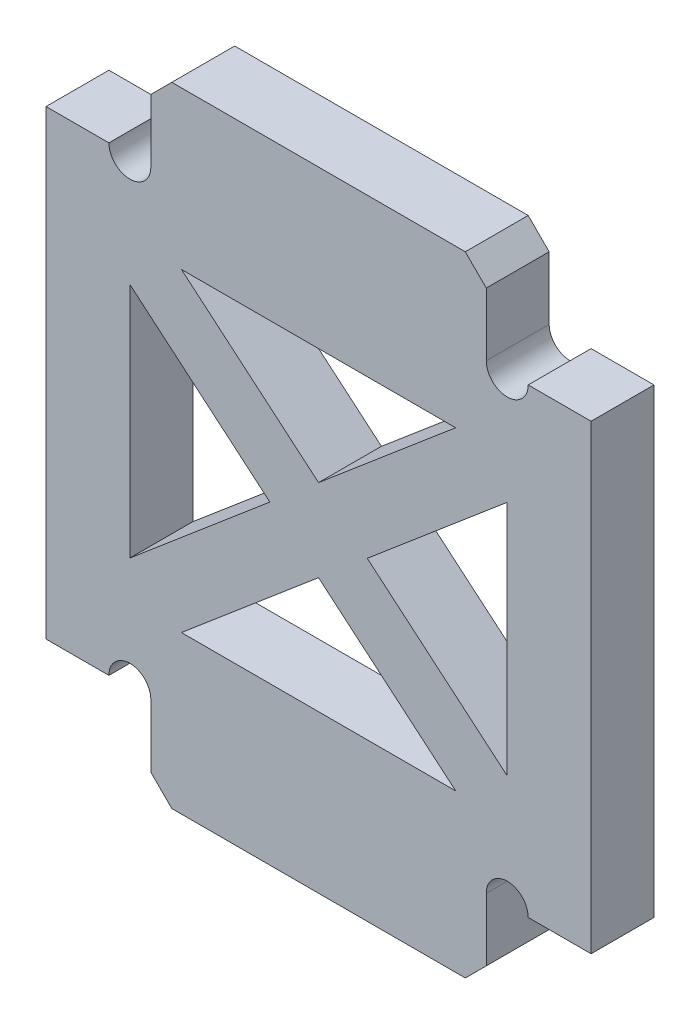
ISO-10303-21;
HEADER;
FILE_DESCRIPTION(('STEP AP214'),'2;1');
FILE_NAME('part.step','',(''),(''),'','','');
FILE_SCHEMA(('AUTOMOTIVE_DESIGN { 1 0 10303 214 1 1 1 1 }'));
ENDSEC;
DATA;
#1=APPLICATION_CONTEXT('core data for automotive mechanical design processes');
#2=APPLICATION_PROTOCOL_DEFINITION('international standard','automotive_design',2000,#1);
#3=PRODUCT_CONTEXT('',#1,'mechanical');
#4=PRODUCT('Part','Part','',(#3));
#5=PRODUCT_RELATED_PRODUCT_CATEGORY('part','',(#4));
#6=PRODUCT_DEFINITION_FORMATION('','',#4);
#7=PRODUCT_DEFINITION_CONTEXT('part definition',#1,'design');
#8=PRODUCT_DEFINITION('design','',#6,#7);
#9=PRODUCT_DEFINITION_SHAPE('','',#8);
#10=(LENGTH_UNIT() NAMED_UNIT(*) SI_UNIT(.MILLI.,.METRE.));
#11=(NAMED_UNIT(*) PLANE_ANGLE_UNIT() SI_UNIT($,.RADIAN.));
#12=(NAMED_UNIT(*) SI_UNIT($,.STERADIAN.) SOLID_ANGLE_UNIT());
#13=UNCERTAINTY_MEASURE_WITH_UNIT(LENGTH_MEASURE(1.E-05),#10,'distance_accuracy_value','');
#14=(GEOMETRIC_REPRESENTATION_CONTEXT(3) GLOBAL_UNCERTAINTY_ASSIGNED_CONTEXT((#13)) GLOBAL_UNIT_ASSIGNED_CONTEXT((#10,
#11,#12)) REPRESENTATION_CONTEXT('',''));
#15=CARTESIAN_POINT('',(0.,0.,0.));
#16=DIRECTION('',(0.,0.,1.));
#17=DIRECTION('',(1.,0.,0.));
#18=AXIS2_PLACEMENT_3D('',#15,#16,#17);
#19=CARTESIAN_POINT('',(0.,-11.,1.5));
#20=DIRECTION('',(0.,1.,0.));
#21=DIRECTION('',(0.,0.,1.));
#22=AXIS2_PLACEMENT_3D('',#19,#20,#21);
#23=PLANE('',#22);
#24=DIRECTION('',(1.,0.,0.));
#25=VECTOR('',#24,1.);
#26=CARTESIAN_POINT('',(0.,-11.,-1.5));
#27=LINE('',#26,#25);
#28=CARTESIAN_POINT('',(-13.,-11.,-1.5));
#29=VERTEX_POINT('',#28);
#30=CARTESIAN_POINT('',(-10.,-11.,-1.5));
#31=VERTEX_POINT('',#30);
#32=EDGE_CURVE('E373',#29,#31,#27,.T.);
#33=ORIENTED_EDGE('',*,*,#32,.T.);
#34=DIRECTION('',(0.,0.,-1.));
#35=VECTOR('',#34,1.);
#36=CARTESIAN_POINT('',(-10.,-11.,1.5));
#37=LINE('',#36,#35);
#38=CARTESIAN_POINT('',(-10.,-11.,1.5));
#39=VERTEX_POINT('',#38);
#40=EDGE_CURVE('E437',#39,#31,#37,.T.);
#41=ORIENTED_EDGE('',*,*,#40,.F.);
#42=DIRECTION('',(1.,0.,0.));
#43=VECTOR('',#42,1.);
#44=CARTESIAN_POINT('',(0.,-11.,1.5));
#45=LINE('',#44,#43);
#46=CARTESIAN_POINT('',(-13.,-11.,1.5));
#47=VERTEX_POINT('',#46);
#48=EDGE_CURVE('E301',#47,#39,#45,.T.);
#49=ORIENTED_EDGE('',*,*,#48,.F.);
#50=DIRECTION('',(0.,0.,-1.));
#51=VECTOR('',#50,1.);
#52=CARTESIAN_POINT('',(-13.,-11.,1.5));
#53=LINE('',#52,#51);
#54=EDGE_CURVE('E411',#47,#29,#53,.T.);
#55=ORIENTED_EDGE('',*,*,#54,.T.);
#56=EDGE_LOOP('',(#33,#41,#49,#55));
#57=FACE_BOUND('',#56,.T.);
#58=ADVANCED_FACE('F37',(#57),#23,.F.);
#59=CARTESIAN_POINT('',(-9.,-11.,1.5));
#60=DIRECTION('',(0.,0.,-1.));
#61=DIRECTION('',(-1.,0.,0.));
#62=AXIS2_PLACEMENT_3D('',#59,#60,#61);
#63=CYLINDRICAL_SURFACE('',#62,1.);
#64=CARTESIAN_POINT('',(-9.,-11.,-1.5));
#65=DIRECTION('',(0.,0.,1.));
#66=DIRECTION('',(1.,0.,0.));
#67=AXIS2_PLACEMENT_3D('',#64,#65,#66);
#68=CIRCLE('',#67,1.);
#69=CARTESIAN_POINT('',(-8.,-11.,-1.5));
#70=VERTEX_POINT('',#69);
#71=EDGE_CURVE('E376',#31,#70,#68,.F.);
#72=ORIENTED_EDGE('',*,*,#71,.T.);
#73=DIRECTION('',(0.,0.,-1.));
#74=VECTOR('',#73,1.);
#75=CARTESIAN_POINT('',(-8.,-11.,1.5));
#76=LINE('',#75,#74);
#77=CARTESIAN_POINT('',(-8.,-11.,1.5));
#78=VERTEX_POINT('',#77);
#79=EDGE_CURVE('E434',#78,#70,#76,.T.);
#80=ORIENTED_EDGE('',*,*,#79,.F.);
#81=CARTESIAN_POINT('',(-9.,-11.,1.5));
#82=DIRECTION('',(0.,0.,1.));
#83=DIRECTION('',(1.,0.,0.));
#84=AXIS2_PLACEMENT_3D('',#81,#82,#83);
#85=CIRCLE('',#84,1.);
#86=EDGE_CURVE('E304',#39,#78,#85,.F.);
#87=ORIENTED_EDGE('',*,*,#86,.F.);
#88=ORIENTED_EDGE('',*,*,#40,.T.);
#89=EDGE_LOOP('',(#72,#80,#87,#88));
#90=FACE_BOUND('',#89,.T.);
#91=ADVANCED_FACE('F529',(#90),#63,.F.);
#92=CARTESIAN_POINT('',(-8.,0.,1.5));
#93=DIRECTION('',(1.,0.,0.));
#94=DIRECTION('',(0.,0.,-1.));
#95=AXIS2_PLACEMENT_3D('',#92,#93,#94);
#96=PLANE('',#95);
#97=DIRECTION('',(0.,-1.,0.));
#98=VECTOR('',#97,1.);
#99=CARTESIAN_POINT('',(-8.,0.,-1.5));
#100=LINE('',#99,#98);
#101=CARTESIAN_POINT('',(-8.,-14.,-1.5));
#102=VERTEX_POINT('',#101);
#103=EDGE_CURVE('E379',#70,#102,#100,.T.);
#104=ORIENTED_EDGE('',*,*,#103,.T.);
#105=DIRECTION('',(0.,0.,1.));
#106=VECTOR('',#105,1.);
#107=CARTESIAN_POINT('',(-8.,-14.,1.5));
#108=LINE('',#107,#106);
#109=CARTESIAN_POINT('',(-8.,-14.,1.5));
#110=VERTEX_POINT('',#109);
#111=EDGE_CURVE('E481',#102,#110,#108,.T.);
#112=ORIENTED_EDGE('',*,*,#111,.T.);
#113=DIRECTION('',(0.,-1.,0.));
#114=VECTOR('',#113,1.);
#115=CARTESIAN_POINT('',(-8.,0.,1.5));
#116=LINE('',#115,#114);
#117=EDGE_CURVE('E307',#78,#110,#116,.T.);
#118=ORIENTED_EDGE('',*,*,#117,.F.);
#119=ORIENTED_EDGE('',*,*,#79,.T.);
#120=EDGE_LOOP('',(#104,#112,#118,#119));
#121=FACE_BOUND('',#120,.T.);
#122=ADVANCED_FACE('F585',(#121),#96,.F.);
#123=CARTESIAN_POINT('',(0.,-15.,1.5));
#124=DIRECTION('',(0.,1.,0.));
#125=DIRECTION('',(0.,0.,1.));
#126=AXIS2_PLACEMENT_3D('',#123,#124,#125);
#127=PLANE('',#126);
#128=DIRECTION('',(1.,0.,0.));
#129=VECTOR('',#128,1.);
#130=CARTESIAN_POINT('',(0.,-15.,-1.5));
#131=LINE('',#130,#129);
#132=CARTESIAN_POINT('',(-7.,-15.,-1.5));
#133=VERTEX_POINT('',#132);
#134=CARTESIAN_POINT('',(6.99999999999999,-15.,-1.5));
#135=VERTEX_POINT('',#134);
#136=EDGE_CURVE('E382',#133,#135,#131,.T.);
#137=ORIENTED_EDGE('',*,*,#136,.T.);
#138=DIRECTION('',(0.,0.,1.));
#139=VECTOR('',#138,1.);
#140=CARTESIAN_POINT('',(6.99999999999999,-15.,1.5));
#141=LINE('',#140,#139);
#142=CARTESIAN_POINT('',(6.99999999999999,-15.,1.5));
#143=VERTEX_POINT('',#142);
#144=EDGE_CURVE('E473',#135,#143,#141,.T.);
#145=ORIENTED_EDGE('',*,*,#144,.T.);
#146=DIRECTION('',(1.,0.,0.));
#147=VECTOR('',#146,1.);
#148=CARTESIAN_POINT('',(0.,-15.,1.5));
#149=LINE('',#148,#147);
#150=CARTESIAN_POINT('',(-7.,-15.,1.5));
#151=VERTEX_POINT('',#150);
#152=EDGE_CURVE('E310',#151,#143,#149,.T.);
#153=ORIENTED_EDGE('',*,*,#152,.F.);
#154=DIRECTION('',(0.,0.,-1.));
#155=VECTOR('',#154,1.);
#156=CARTESIAN_POINT('',(-7.,-15.,1.5));
#157=LINE('',#156,#155);
#158=EDGE_CURVE('E470',#151,#133,#157,.T.);
#159=ORIENTED_EDGE('',*,*,#158,.T.);
#160=EDGE_LOOP('',(#137,#145,#153,#159));
#161=FACE_BOUND('',#160,.T.);
#162=ADVANCED_FACE('F541',(#161),#127,.F.);
#163=CARTESIAN_POINT('',(8.,0.,1.5));
#164=DIRECTION('',(1.,0.,0.));
#165=DIRECTION('',(0.,0.,-1.));
#166=AXIS2_PLACEMENT_3D('',#163,#164,#165);
#167=PLANE('',#166);
#168=DIRECTION('',(0.,-1.,0.));
#169=VECTOR('',#168,1.);
#170=CARTESIAN_POINT('',(8.,0.,1.5));
#171=LINE('',#170,#169);
#172=CARTESIAN_POINT('',(8.,-11.,1.5));
#173=VERTEX_POINT('',#172);
#174=CARTESIAN_POINT('',(8.,-14.,1.5));
#175=VERTEX_POINT('',#174);
#176=EDGE_CURVE('E313',#173,#175,#171,.T.);
#177=ORIENTED_EDGE('',*,*,#176,.T.);
#178=DIRECTION('',(0.,0.,-1.));
#179=VECTOR('',#178,1.);
#180=CARTESIAN_POINT('',(8.,-14.,-1.5));
#181=LINE('',#180,#179);
#182=CARTESIAN_POINT('',(8.,-14.,-1.5));
#183=VERTEX_POINT('',#182);
#184=EDGE_CURVE('E440',#175,#183,#181,.T.);
#185=ORIENTED_EDGE('',*,*,#184,.T.);
#186=DIRECTION('',(0.,-1.,0.));
#187=VECTOR('',#186,1.);
#188=CARTESIAN_POINT('',(8.,0.,-1.5));
#189=LINE('',#188,#187);
#190=CARTESIAN_POINT('',(8.,-11.,-1.5));
#191=VERTEX_POINT('',#190);
#192=EDGE_CURVE('E385',#191,#183,#189,.T.);
#193=ORIENTED_EDGE('',*,*,#192,.F.);
#194=DIRECTION('',(0.,0.,-1.));
#195=VECTOR('',#194,1.);
#196=CARTESIAN_POINT('',(8.,-11.,1.5));
#197=LINE('',#196,#195);
#198=EDGE_CURVE('E432',#173,#191,#197,.T.);
#199=ORIENTED_EDGE('',*,*,#198,.F.);
#200=EDGE_LOOP('',(#177,#185,#193,#199));
#201=FACE_BOUND('',#200,.T.);
#202=ADVANCED_FACE('F550',(#201),#167,.T.);
#203=CARTESIAN_POINT('',(9.,-11.,1.5));
#204=DIRECTION('',(0.,0.,-1.));
#205=DIRECTION('',(-1.,0.,0.));
#206=AXIS2_PLACEMENT_3D('',#203,#204,#205);
#207=CYLINDRICAL_SURFACE('',#206,1.);
#208=CARTESIAN_POINT('',(9.,-11.,-1.5));
#209=DIRECTION('',(0.,0.,1.));
#210=DIRECTION('',(1.,0.,0.));
#211=AXIS2_PLACEMENT_3D('',#208,#209,#210);
#212=CIRCLE('',#211,1.);
#213=CARTESIAN_POINT('',(10.,-11.,-1.5));
#214=VERTEX_POINT('',#213);
#215=EDGE_CURVE('E388',#214,#191,#212,.T.);
#216=ORIENTED_EDGE('',*,*,#215,.F.);
#217=DIRECTION('',(0.,0.,-1.));
#218=VECTOR('',#217,1.);
#219=CARTESIAN_POINT('',(10.,-11.,1.5));
#220=LINE('',#219,#218);
#221=CARTESIAN_POINT('',(10.,-11.,1.5));
#222=VERTEX_POINT('',#221);
#223=EDGE_CURVE('E430',#222,#214,#220,.T.);
#224=ORIENTED_EDGE('',*,*,#223,.F.);
#225=CARTESIAN_POINT('',(9.,-11.,1.5));
#226=DIRECTION('',(0.,0.,1.));
#227=DIRECTION('',(1.,0.,0.));
#228=AXIS2_PLACEMENT_3D('',#225,#226,#227);
#229=CIRCLE('',#228,1.);
#230=EDGE_CURVE('E316',#222,#173,#229,.T.);
#231=ORIENTED_EDGE('',*,*,#230,.T.);
#232=ORIENTED_EDGE('',*,*,#198,.T.);
#233=EDGE_LOOP('',(#216,#224,#231,#232));
#234=FACE_BOUND('',#233,.T.);
#235=ADVANCED_FACE('F555',(#234),#207,.F.);
#236=CARTESIAN_POINT('',(13.,-11.,-1.5));
#237=VERTEX_POINT('',#236);
#238=EDGE_CURVE('E377',#214,#237,#27,.T.);
#239=ORIENTED_EDGE('',*,*,#238,.T.);
#240=DIRECTION('',(0.,0.,-1.));
#241=VECTOR('',#240,1.);
#242=CARTESIAN_POINT('',(13.,-11.,1.5));
#243=LINE('',#242,#241);
#244=CARTESIAN_POINT('',(13.,-11.,1.5));
#245=VERTEX_POINT('',#244);
#246=EDGE_CURVE('E428',#245,#237,#243,.T.);
#247=ORIENTED_EDGE('',*,*,#246,.F.);
#248=EDGE_CURVE('E305',#222,#245,#45,.T.);
#249=ORIENTED_EDGE('',*,*,#248,.F.);
#250=ORIENTED_EDGE('',*,*,#223,.T.);
#251=EDGE_LOOP('',(#239,#247,#249,#250));
#252=FACE_BOUND('',#251,.T.);
#253=ADVANCED_FACE('F561',(#252),#23,.F.);
#254=CARTESIAN_POINT('',(13.,0.,1.5));
#255=DIRECTION('',(1.,0.,0.));
#256=DIRECTION('',(0.,0.,-1.));
#257=AXIS2_PLACEMENT_3D('',#254,#255,#256);
#258=PLANE('',#257);
#259=DIRECTION('',(0.,-1.,0.));
#260=VECTOR('',#259,1.);
#261=CARTESIAN_POINT('',(13.,0.,-1.5));
#262=LINE('',#261,#260);
#263=CARTESIAN_POINT('',(13.,11.,-1.5));
#264=VERTEX_POINT('',#263);
#265=EDGE_CURVE('E391',#264,#237,#262,.T.);
#266=ORIENTED_EDGE('',*,*,#265,.F.);
#267=DIRECTION('',(0.,0.,-1.));
#268=VECTOR('',#267,1.);
#269=CARTESIAN_POINT('',(13.,11.,1.5));
#270=LINE('',#269,#268);
#271=CARTESIAN_POINT('',(13.,11.,1.5));
#272=VERTEX_POINT('',#271);
#273=EDGE_CURVE('E426',#272,#264,#270,.T.);
#274=ORIENTED_EDGE('',*,*,#273,.F.);
#275=DIRECTION('',(0.,-1.,0.));
#276=VECTOR('',#275,1.);
#277=CARTESIAN_POINT('',(13.,0.,1.5));
#278=LINE('',#277,#276);
#279=EDGE_CURVE('E319',#272,#245,#278,.T.);
#280=ORIENTED_EDGE('',*,*,#279,.T.);
#281=ORIENTED_EDGE('',*,*,#246,.T.);
#282=EDGE_LOOP('',(#266,#274,#280,#281));
#283=FACE_BOUND('',#282,.T.);
#284=ADVANCED_FACE('F571',(#283),#258,.T.);
#285=CARTESIAN_POINT('',(0.,11.,1.5));
#286=DIRECTION('',(0.,1.,0.));
#287=DIRECTION('',(0.,0.,1.));
#288=AXIS2_PLACEMENT_3D('',#285,#286,#287);
#289=PLANE('',#288);
#290=DIRECTION('',(1.,0.,0.));
#291=VECTOR('',#290,1.);
#292=CARTESIAN_POINT('',(0.,11.,-1.5));
#293=LINE('',#292,#291);
#294=CARTESIAN_POINT('',(10.,11.,-1.5));
#295=VERTEX_POINT('',#294);
#296=EDGE_CURVE('E394',#295,#264,#293,.T.);
#297=ORIENTED_EDGE('',*,*,#296,.F.);
#298=DIRECTION('',(0.,0.,-1.));
#299=VECTOR('',#298,1.);
#300=CARTESIAN_POINT('',(10.,11.,1.5));
#301=LINE('',#300,#299);
#302=CARTESIAN_POINT('',(10.,11.,1.5));
#303=VERTEX_POINT('',#302);
#304=EDGE_CURVE('E424',#303,#295,#301,.T.);
#305=ORIENTED_EDGE('',*,*,#304,.F.);
#306=DIRECTION('',(1.,0.,0.));
#307=VECTOR('',#306,1.);
#308=CARTESIAN_POINT('',(0.,11.,1.5));
#309=LINE('',#308,#307);
#310=EDGE_CURVE('E322',#303,#272,#309,.T.);
#311=ORIENTED_EDGE('',*,*,#310,.T.);
#312=ORIENTED_EDGE('',*,*,#273,.T.);
#313=EDGE_LOOP('',(#297,#305,#311,#312));
#314=FACE_BOUND('',#313,.T.);
#315=ADVANCED_FACE('F566',(#314),#289,.T.);
#316=CARTESIAN_POINT('',(9.,11.,1.5));
#317=DIRECTION('',(0.,0.,-1.));
#318=DIRECTION('',(-1.,0.,0.));
#319=AXIS2_PLACEMENT_3D('',#316,#317,#318);
#320=CYLINDRICAL_SURFACE('',#319,1.);
#321=CARTESIAN_POINT('',(9.,11.,-1.5));
#322=DIRECTION('',(0.,0.,1.));
#323=DIRECTION('',(1.,0.,0.));
#324=AXIS2_PLACEMENT_3D('',#321,#322,#323);
#325=CIRCLE('',#324,1.);
#326=CARTESIAN_POINT('',(8.,11.,-1.5));
#327=VERTEX_POINT('',#326);
#328=EDGE_CURVE('E397',#295,#327,#325,.F.);
#329=ORIENTED_EDGE('',*,*,#328,.T.);
#330=DIRECTION('',(0.,0.,-1.));
#331=VECTOR('',#330,1.);
#332=CARTESIAN_POINT('',(8.,11.,1.5));
#333=LINE('',#332,#331);
#334=CARTESIAN_POINT('',(8.,11.,1.5));
#335=VERTEX_POINT('',#334);
#336=EDGE_CURVE('E421',#335,#327,#333,.T.);
#337=ORIENTED_EDGE('',*,*,#336,.F.);
#338=CARTESIAN_POINT('',(9.,11.,1.5));
#339=DIRECTION('',(0.,0.,1.));
#340=DIRECTION('',(1.,0.,0.));
#341=AXIS2_PLACEMENT_3D('',#338,#339,#340);
#342=CIRCLE('',#341,1.);
#343=EDGE_CURVE('E325',#303,#335,#342,.F.);
#344=ORIENTED_EDGE('',*,*,#343,.F.);
#345=ORIENTED_EDGE('',*,*,#304,.T.);
#346=EDGE_LOOP('',(#329,#337,#344,#345));
#347=FACE_BOUND('',#346,.T.);
#348=ADVANCED_FACE('F570',(#347),#320,.F.);
#349=CARTESIAN_POINT('',(8.,0.,1.5));
#350=DIRECTION('',(-1.,0.,0.));
#351=DIRECTION('',(0.,0.,1.));
#352=AXIS2_PLACEMENT_3D('',#349,#350,#351);
#353=PLANE('',#352);
#354=DIRECTION('',(0.,1.,0.));
#355=VECTOR('',#354,1.);
#356=CARTESIAN_POINT('',(8.,0.,-1.5));
#357=LINE('',#356,#355);
#358=CARTESIAN_POINT('',(8.,14.,-1.5));
#359=VERTEX_POINT('',#358);
#360=EDGE_CURVE('E399',#327,#359,#357,.T.);
#361=ORIENTED_EDGE('',*,*,#360,.T.);
#362=DIRECTION('',(0.,0.,1.));
#363=VECTOR('',#362,1.);
#364=CARTESIAN_POINT('',(8.,14.,1.5));
#365=LINE('',#364,#363);
#366=CARTESIAN_POINT('',(8.,14.,1.5));
#367=VERTEX_POINT('',#366);
#368=EDGE_CURVE('E45',#359,#367,#365,.T.);
#369=ORIENTED_EDGE('',*,*,#368,.T.);
#370=DIRECTION('',(0.,1.,0.));
#371=VECTOR('',#370,1.);
#372=CARTESIAN_POINT('',(8.,0.,1.5));
#373=LINE('',#372,#371);
#374=EDGE_CURVE('E328',#335,#367,#373,.T.);
#375=ORIENTED_EDGE('',*,*,#374,.F.);
#376=ORIENTED_EDGE('',*,*,#336,.T.);
#377=EDGE_LOOP('',(#361,#369,#375,#376));
#378=FACE_BOUND('',#377,.T.);
#379=ADVANCED_FACE('F490',(#378),#353,.F.);
#380=CARTESIAN_POINT('',(0.,15.,1.5));
#381=DIRECTION('',(0.,1.,0.));
#382=DIRECTION('',(0.,0.,1.));
#383=AXIS2_PLACEMENT_3D('',#380,#381,#382);
#384=PLANE('',#383);
#385=DIRECTION('',(1.,0.,0.));
#386=VECTOR('',#385,1.);
#387=CARTESIAN_POINT('',(0.,15.,1.5));
#388=LINE('',#387,#386);
#389=CARTESIAN_POINT('',(-6.99999999999999,15.,1.5));
#390=VERTEX_POINT('',#389);
#391=CARTESIAN_POINT('',(7.,15.,1.5));
#392=VERTEX_POINT('',#391);
#393=EDGE_CURVE('E330',#390,#392,#388,.T.);
#394=ORIENTED_EDGE('',*,*,#393,.T.);
#395=DIRECTION('',(0.,0.,-1.));
#396=VECTOR('',#395,1.);
#397=CARTESIAN_POINT('',(7.,15.,-1.5));
#398=LINE('',#397,#396);
#399=CARTESIAN_POINT('',(7.,15.,-1.5));
#400=VERTEX_POINT('',#399);
#401=EDGE_CURVE('E485',#392,#400,#398,.T.);
#402=ORIENTED_EDGE('',*,*,#401,.T.);
#403=DIRECTION('',(1.,0.,0.));
#404=VECTOR('',#403,1.);
#405=CARTESIAN_POINT('',(0.,15.,-1.5));
#406=LINE('',#405,#404);
#407=CARTESIAN_POINT('',(-6.99999999999999,15.,-1.5));
#408=VERTEX_POINT('',#407);
#409=EDGE_CURVE('E402',#408,#400,#406,.T.);
#410=ORIENTED_EDGE('',*,*,#409,.F.);
#411=DIRECTION('',(0.,0.,1.));
#412=VECTOR('',#411,1.);
#413=CARTESIAN_POINT('',(-6.99999999999999,15.,1.5));
#414=LINE('',#413,#412);
#415=EDGE_CURVE('E483',#408,#390,#414,.T.);
#416=ORIENTED_EDGE('',*,*,#415,.T.);
#417=EDGE_LOOP('',(#394,#402,#410,#416));
#418=FACE_BOUND('',#417,.T.);
#419=ADVANCED_FACE('F500',(#418),#384,.T.);
#420=CARTESIAN_POINT('',(-8.,0.,1.5));
#421=DIRECTION('',(-1.,0.,0.));
#422=DIRECTION('',(0.,0.,1.));
#423=AXIS2_PLACEMENT_3D('',#420,#421,#422);
#424=PLANE('',#423);
#425=DIRECTION('',(0.,1.,0.));
#426=VECTOR('',#425,1.);
#427=CARTESIAN_POINT('',(-8.,0.,1.5));
#428=LINE('',#427,#426);
#429=CARTESIAN_POINT('',(-8.,11.,1.5));
#430=VERTEX_POINT('',#429);
#431=CARTESIAN_POINT('',(-8.,14.,1.5));
#432=VERTEX_POINT('',#431);
#433=EDGE_CURVE('E332',#430,#432,#428,.T.);
#434=ORIENTED_EDGE('',*,*,#433,.T.);
#435=DIRECTION('',(0.,0.,-1.));
#436=VECTOR('',#435,1.);
#437=CARTESIAN_POINT('',(-8.,14.,1.5));
#438=LINE('',#437,#436);
#439=CARTESIAN_POINT('',(-8.,14.,-1.5));
#440=VERTEX_POINT('',#439);
#441=EDGE_CURVE('E11',#432,#440,#438,.T.);
#442=ORIENTED_EDGE('',*,*,#441,.T.);
#443=DIRECTION('',(0.,1.,0.));
#444=VECTOR('',#443,1.);
#445=CARTESIAN_POINT('',(-8.,0.,-1.5));
#446=LINE('',#445,#444);
#447=CARTESIAN_POINT('',(-8.,11.,-1.5));
#448=VERTEX_POINT('',#447);
#449=EDGE_CURVE('E405',#448,#440,#446,.T.);
#450=ORIENTED_EDGE('',*,*,#449,.F.);
#451=DIRECTION('',(0.,0.,-1.));
#452=VECTOR('',#451,1.);
#453=CARTESIAN_POINT('',(-8.,11.,1.5));
#454=LINE('',#453,#452);
#455=EDGE_CURVE('E419',#430,#448,#454,.T.);
#456=ORIENTED_EDGE('',*,*,#455,.F.);
#457=EDGE_LOOP('',(#434,#442,#450,#456));
#458=FACE_BOUND('',#457,.T.);
#459=ADVANCED_FACE('F508',(#458),#424,.T.);
#460=CARTESIAN_POINT('',(-9.,11.,1.5));
#461=DIRECTION('',(0.,0.,-1.));
#462=DIRECTION('',(-1.,0.,0.));
#463=AXIS2_PLACEMENT_3D('',#460,#461,#462);
#464=CYLINDRICAL_SURFACE('',#463,1.);
#465=CARTESIAN_POINT('',(-9.,11.,-1.5));
#466=DIRECTION('',(0.,0.,1.));
#467=DIRECTION('',(1.,0.,0.));
#468=AXIS2_PLACEMENT_3D('',#465,#466,#467);
#469=CIRCLE('',#468,1.);
#470=CARTESIAN_POINT('',(-10.,11.,-1.5));
#471=VERTEX_POINT('',#470);
#472=EDGE_CURVE('E408',#471,#448,#469,.T.);
#473=ORIENTED_EDGE('',*,*,#472,.F.);
#474=DIRECTION('',(0.,0.,-1.));
#475=VECTOR('',#474,1.);
#476=CARTESIAN_POINT('',(-10.,11.,1.5));
#477=LINE('',#476,#475);
#478=CARTESIAN_POINT('',(-10.,11.,1.5));
#479=VERTEX_POINT('',#478);
#480=EDGE_CURVE('E417',#479,#471,#477,.T.);
#481=ORIENTED_EDGE('',*,*,#480,.F.);
#482=CARTESIAN_POINT('',(-9.,11.,1.5));
#483=DIRECTION('',(0.,0.,1.));
#484=DIRECTION('',(1.,0.,0.));
#485=AXIS2_PLACEMENT_3D('',#482,#483,#484);
#486=CIRCLE('',#485,1.);
#487=EDGE_CURVE('E334',#479,#430,#486,.T.);
#488=ORIENTED_EDGE('',*,*,#487,.T.);
#489=ORIENTED_EDGE('',*,*,#455,.T.);
#490=EDGE_LOOP('',(#473,#481,#488,#489));
#491=FACE_BOUND('',#490,.T.);
#492=ADVANCED_FACE('F514',(#491),#464,.F.);
#493=CARTESIAN_POINT('',(-13.,11.,-1.5));
#494=VERTEX_POINT('',#493);
#495=EDGE_CURVE('E273',#494,#471,#293,.T.);
#496=ORIENTED_EDGE('',*,*,#495,.F.);
#497=DIRECTION('',(0.,0.,-1.));
#498=VECTOR('',#497,1.);
#499=CARTESIAN_POINT('',(-13.,11.,1.5));
#500=LINE('',#499,#498);
#501=CARTESIAN_POINT('',(-13.,11.,1.5));
#502=VERTEX_POINT('',#501);
#503=EDGE_CURVE('E414',#502,#494,#500,.T.);
#504=ORIENTED_EDGE('',*,*,#503,.F.);
#505=EDGE_CURVE('E326',#502,#479,#309,.T.);
#506=ORIENTED_EDGE('',*,*,#505,.T.);
#507=ORIENTED_EDGE('',*,*,#480,.T.);
#508=EDGE_LOOP('',(#496,#504,#506,#507));
#509=FACE_BOUND('',#508,.T.);
#510=ADVANCED_FACE('F518',(#509),#289,.T.);
#511=CARTESIAN_POINT('',(-0.968913362199259,-1.14507942805367,1.5));
#512=DIRECTION('',(-0.645942241466174,-0.763386285369115,0.));
#513=DIRECTION('',(0.763386285369115,-0.645942241466174,0.));
#514=AXIS2_PLACEMENT_3D('',#511,#512,#513);
#515=PLANE('',#514);
#516=DIRECTION('',(-0.763386285369115,0.645942241466174,0.));
#517=VECTOR('',#516,1.);
#518=CARTESIAN_POINT('',(-0.968913362199259,-1.14507942805367,-1.5));
#519=LINE('',#518,#517);
#520=CARTESIAN_POINT('',(-2.32218904989905,0.,-1.5));
#521=VERTEX_POINT('',#520);
#522=CARTESIAN_POINT('',(-9.,5.65045541931618,-1.5));
#523=VERTEX_POINT('',#522);
#524=EDGE_CURVE('E364',#521,#523,#519,.T.);
#525=ORIENTED_EDGE('',*,*,#524,.F.);
#526=DIRECTION('',(0.,0.,-1.));
#527=VECTOR('',#526,1.);
#528=CARTESIAN_POINT('',(-2.32218904989905,0.,1.5));
#529=LINE('',#528,#527);
#530=CARTESIAN_POINT('',(-2.32218904989905,0.,1.5));
#531=VERTEX_POINT('',#530);
#532=EDGE_CURVE('E415',#531,#521,#529,.T.);
#533=ORIENTED_EDGE('',*,*,#532,.F.);
#534=DIRECTION('',(-0.763386285369115,0.645942241466174,0.));
#535=VECTOR('',#534,1.);
#536=CARTESIAN_POINT('',(-0.968913362199259,-1.14507942805367,1.5));
#537=LINE('',#536,#535);
#538=CARTESIAN_POINT('',(-9.,5.65045541931618,1.5));
#539=VERTEX_POINT('',#538);
#540=EDGE_CURVE('E293',#531,#539,#537,.T.);
#541=ORIENTED_EDGE('',*,*,#540,.T.);
#542=DIRECTION('',(0.,0.,-1.));
#543=VECTOR('',#542,1.);
#544=CARTESIAN_POINT('',(-9.,5.65045541931618,1.5));
#545=LINE('',#544,#543);
#546=EDGE_CURVE('E441',#539,#523,#545,.T.);
#547=ORIENTED_EDGE('',*,*,#546,.T.);
#548=EDGE_LOOP('',(#525,#533,#541,#547));
#549=FACE_BOUND('',#548,.T.);
#550=ADVANCED_FACE('F605',(#549),#515,.T.);
#551=CARTESIAN_POINT('',(-0.968913362199259,1.14507942805367,1.5));
#552=DIRECTION('',(0.645942241466174,-0.763386285369115,0.));
#553=DIRECTION('',(0.763386285369115,0.645942241466174,0.));
#554=AXIS2_PLACEMENT_3D('',#551,#552,#553);
#555=PLANE('',#554);
#556=DIRECTION('',(-0.763386285369115,-0.645942241466174,0.));
#557=VECTOR('',#556,1.);
#558=CARTESIAN_POINT('',(-0.968913362199259,1.14507942805367,-1.5));
#559=LINE('',#558,#557);
#560=CARTESIAN_POINT('',(-9.,-5.65045541931618,-1.5));
#561=VERTEX_POINT('',#560);
#562=EDGE_CURVE('E367',#521,#561,#559,.T.);
#563=ORIENTED_EDGE('',*,*,#562,.T.);
#564=DIRECTION('',(0.,0.,-1.));
#565=VECTOR('',#564,1.);
#566=CARTESIAN_POINT('',(-9.,-5.65045541931618,1.5));
#567=LINE('',#566,#565);
#568=CARTESIAN_POINT('',(-9.,-5.65045541931618,1.5));
#569=VERTEX_POINT('',#568);
#570=EDGE_CURVE('E443',#569,#561,#567,.T.);
#571=ORIENTED_EDGE('',*,*,#570,.F.);
#572=DIRECTION('',(-0.763386285369115,-0.645942241466174,0.));
#573=VECTOR('',#572,1.);
#574=CARTESIAN_POINT('',(-0.968913362199259,1.14507942805367,1.5));
#575=LINE('',#574,#573);
#576=EDGE_CURVE('E296',#531,#569,#575,.T.);
#577=ORIENTED_EDGE('',*,*,#576,.F.);
#578=ORIENTED_EDGE('',*,*,#532,.T.);
#579=EDGE_LOOP('',(#563,#571,#577,#578));
#580=FACE_BOUND('',#579,.T.);
#581=ADVANCED_FACE('F601',(#580),#555,.F.);
#582=CARTESIAN_POINT('',(0.,7.5,1.5));
#583=DIRECTION('',(0.,-1.,0.));
#584=DIRECTION('',(0.,0.,-1.));
#585=AXIS2_PLACEMENT_3D('',#582,#583,#584);
#586=PLANE('',#585);
#587=DIRECTION('',(-1.,0.,0.));
#588=VECTOR('',#587,1.);
#589=CARTESIAN_POINT('',(0.,7.5,-1.5));
#590=LINE('',#589,#588);
#591=CARTESIAN_POINT('',(6.54144731373731,7.5,-1.5));
#592=VERTEX_POINT('',#591);
#593=CARTESIAN_POINT('',(-6.54144731373731,7.5,-1.5));
#594=VERTEX_POINT('',#593);
#595=EDGE_CURVE('E355',#592,#594,#590,.T.);
#596=ORIENTED_EDGE('',*,*,#595,.F.);
#597=DIRECTION('',(0.,0.,-1.));
#598=VECTOR('',#597,1.);
#599=CARTESIAN_POINT('',(6.54144731373731,7.5,1.5));
#600=LINE('',#599,#598);
#601=CARTESIAN_POINT('',(6.54144731373731,7.5,1.5));
#602=VERTEX_POINT('',#601);
#603=EDGE_CURVE('E444',#602,#592,#600,.T.);
#604=ORIENTED_EDGE('',*,*,#603,.F.);
#605=DIRECTION('',(-1.,0.,0.));
#606=VECTOR('',#605,1.);
#607=CARTESIAN_POINT('',(0.,7.5,1.5));
#608=LINE('',#607,#606);
#609=CARTESIAN_POINT('',(-6.54144731373731,7.5,1.5));
#610=VERTEX_POINT('',#609);
#611=EDGE_CURVE('E285',#602,#610,#608,.T.);
#612=ORIENTED_EDGE('',*,*,#611,.T.);
#613=DIRECTION('',(0.,0.,-1.));
#614=VECTOR('',#613,1.);
#615=CARTESIAN_POINT('',(-6.54144731373731,7.5,1.5));
#616=LINE('',#615,#614);
#617=EDGE_CURVE('E447',#610,#594,#616,.T.);
#618=ORIENTED_EDGE('',*,*,#617,.T.);
#619=EDGE_LOOP('',(#596,#604,#612,#618));
#620=FACE_BOUND('',#619,.T.);
#621=ADVANCED_FACE('F604',(#620),#586,.T.);
#622=CARTESIAN_POINT('',(-0.968913362199264,1.14507942805368,1.5));
#623=DIRECTION('',(0.645942241466174,-0.763386285369115,0.));
#624=DIRECTION('',(0.763386285369115,0.645942241466174,0.));
#625=AXIS2_PLACEMENT_3D('',#622,#623,#624);
#626=PLANE('',#625);
#627=DIRECTION('',(-0.763386285369115,-0.645942241466174,0.));
#628=VECTOR('',#627,1.);
#629=CARTESIAN_POINT('',(-0.968913362199264,1.14507942805368,-1.5));
#630=LINE('',#629,#628);
#631=CARTESIAN_POINT('',(0.,1.96492919606844,-1.5));
#632=VERTEX_POINT('',#631);
#633=EDGE_CURVE('E358',#592,#632,#630,.T.);
#634=ORIENTED_EDGE('',*,*,#633,.T.);
#635=DIRECTION('',(0.,0.,-1.));
#636=VECTOR('',#635,1.);
#637=CARTESIAN_POINT('',(0.,1.96492919606844,1.5));
#638=LINE('',#637,#636);
#639=CARTESIAN_POINT('',(0.,1.96492919606844,1.5));
#640=VERTEX_POINT('',#639);
#641=EDGE_CURVE('E449',#640,#632,#638,.T.);
#642=ORIENTED_EDGE('',*,*,#641,.F.);
#643=DIRECTION('',(-0.763386285369115,-0.645942241466174,0.));
#644=VECTOR('',#643,1.);
#645=CARTESIAN_POINT('',(-0.968913362199264,1.14507942805368,1.5));
#646=LINE('',#645,#644);
#647=EDGE_CURVE('E288',#602,#640,#646,.T.);
#648=ORIENTED_EDGE('',*,*,#647,.F.);
#649=ORIENTED_EDGE('',*,*,#603,.T.);
#650=EDGE_LOOP('',(#634,#642,#648,#649));
#651=FACE_BOUND('',#650,.T.);
#652=ADVANCED_FACE('F614',(#651),#626,.F.);
#653=CARTESIAN_POINT('',(0.968913362199259,1.14507942805367,1.5));
#654=DIRECTION('',(0.645942241466174,0.763386285369115,0.));
#655=DIRECTION('',(-0.763386285369115,0.645942241466174,0.));
#656=AXIS2_PLACEMENT_3D('',#653,#654,#655);
#657=PLANE('',#656);
#658=DIRECTION('',(0.763386285369115,-0.645942241466174,0.));
#659=VECTOR('',#658,1.);
#660=CARTESIAN_POINT('',(0.968913362199259,1.14507942805367,-1.5));
#661=LINE('',#660,#659);
#662=CARTESIAN_POINT('',(2.32218904989905,0.,-1.5));
#663=VERTEX_POINT('',#662);
#664=CARTESIAN_POINT('',(9.,-5.65045541931618,-1.5));
#665=VERTEX_POINT('',#664);
#666=EDGE_CURVE('E346',#663,#665,#661,.T.);
#667=ORIENTED_EDGE('',*,*,#666,.F.);
#668=DIRECTION('',(0.,0.,-1.));
#669=VECTOR('',#668,1.);
#670=CARTESIAN_POINT('',(2.32218904989905,0.,1.5));
#671=LINE('',#670,#669);
#672=CARTESIAN_POINT('',(2.32218904989905,0.,1.5));
#673=VERTEX_POINT('',#672);
#674=EDGE_CURVE('E450',#673,#663,#671,.T.);
#675=ORIENTED_EDGE('',*,*,#674,.F.);
#676=DIRECTION('',(0.763386285369115,-0.645942241466174,0.));
#677=VECTOR('',#676,1.);
#678=CARTESIAN_POINT('',(0.968913362199259,1.14507942805367,1.5));
#679=LINE('',#678,#677);
#680=CARTESIAN_POINT('',(9.,-5.65045541931618,1.5));
#681=VERTEX_POINT('',#680);
#682=EDGE_CURVE('E277',#673,#681,#679,.T.);
#683=ORIENTED_EDGE('',*,*,#682,.T.);
#684=DIRECTION('',(0.,0.,-1.));
#685=VECTOR('',#684,1.);
#686=CARTESIAN_POINT('',(9.,-5.65045541931618,1.5));
#687=LINE('',#686,#685);
#688=EDGE_CURVE('E257',#681,#665,#687,.T.);
#689=ORIENTED_EDGE('',*,*,#688,.T.);
#690=EDGE_LOOP('',(#667,#675,#683,#689));
#691=FACE_BOUND('',#690,.T.);
#692=ADVANCED_FACE('F617',(#691),#657,.T.);
#693=CARTESIAN_POINT('',(0.968913362199259,-1.14507942805367,1.5));
#694=DIRECTION('',(-0.645942241466174,0.763386285369115,0.));
#695=DIRECTION('',(-0.763386285369115,-0.645942241466174,0.));
#696=AXIS2_PLACEMENT_3D('',#693,#694,#695);
#697=PLANE('',#696);
#698=DIRECTION('',(0.763386285369115,0.645942241466174,0.));
#699=VECTOR('',#698,1.);
#700=CARTESIAN_POINT('',(0.968913362199259,-1.14507942805367,-1.5));
#701=LINE('',#700,#699);
#702=CARTESIAN_POINT('',(9.,5.65045541931618,-1.5));
#703=VERTEX_POINT('',#702);
#704=EDGE_CURVE('E349',#663,#703,#701,.T.);
#705=ORIENTED_EDGE('',*,*,#704,.T.);
#706=DIRECTION('',(0.,0.,-1.));
#707=VECTOR('',#706,1.);
#708=CARTESIAN_POINT('',(9.,5.65045541931618,1.5));
#709=LINE('',#708,#707);
#710=CARTESIAN_POINT('',(9.,5.65045541931618,1.5));
#711=VERTEX_POINT('',#710);
#712=EDGE_CURVE('E454',#711,#703,#709,.T.);
#713=ORIENTED_EDGE('',*,*,#712,.F.);
#714=DIRECTION('',(0.763386285369115,0.645942241466174,0.));
#715=VECTOR('',#714,1.);
#716=CARTESIAN_POINT('',(0.968913362199259,-1.14507942805367,1.5));
#717=LINE('',#716,#715);
#718=EDGE_CURVE('E280',#673,#711,#717,.T.);
#719=ORIENTED_EDGE('',*,*,#718,.F.);
#720=ORIENTED_EDGE('',*,*,#674,.T.);
#721=EDGE_LOOP('',(#705,#713,#719,#720));
#722=FACE_BOUND('',#721,.T.);
#723=ADVANCED_FACE('F626',(#722),#697,.F.);
#724=CARTESIAN_POINT('',(-0.968913362199264,-1.14507942805368,1.5));
#725=DIRECTION('',(-0.645942241466174,-0.763386285369115,0.));
#726=DIRECTION('',(0.763386285369115,-0.645942241466174,0.));
#727=AXIS2_PLACEMENT_3D('',#724,#725,#726);
#728=PLANE('',#727);
#729=DIRECTION('',(-0.763386285369115,0.645942241466174,0.));
#730=VECTOR('',#729,1.);
#731=CARTESIAN_POINT('',(-0.968913362199264,-1.14507942805368,-1.5));
#732=LINE('',#731,#730);
#733=CARTESIAN_POINT('',(6.54144731373731,-7.5,-1.5));
#734=VERTEX_POINT('',#733);
#735=CARTESIAN_POINT('',(0.,-1.96492919606844,-1.5));
#736=VERTEX_POINT('',#735);
#737=EDGE_CURVE('E254',#734,#736,#732,.T.);
#738=ORIENTED_EDGE('',*,*,#737,.F.);
#739=DIRECTION('',(0.,0.,-1.));
#740=VECTOR('',#739,1.);
#741=CARTESIAN_POINT('',(6.54144731373731,-7.5,1.5));
#742=LINE('',#741,#740);
#743=CARTESIAN_POINT('',(6.54144731373731,-7.5,1.5));
#744=VERTEX_POINT('',#743);
#745=EDGE_CURVE('E248',#744,#734,#742,.T.);
#746=ORIENTED_EDGE('',*,*,#745,.F.);
#747=DIRECTION('',(-0.763386285369115,0.645942241466174,0.));
#748=VECTOR('',#747,1.);
#749=CARTESIAN_POINT('',(-0.968913362199264,-1.14507942805368,1.5));
#750=LINE('',#749,#748);
#751=CARTESIAN_POINT('',(0.,-1.96492919606844,1.5));
#752=VERTEX_POINT('',#751);
#753=EDGE_CURVE('E252',#744,#752,#750,.T.);
#754=ORIENTED_EDGE('',*,*,#753,.T.);
#755=DIRECTION('',(0.,0.,-1.));
#756=VECTOR('',#755,1.);
#757=CARTESIAN_POINT('',(0.,-1.96492919606844,1.5));
#758=LINE('',#757,#756);
#759=EDGE_CURVE('E339',#752,#736,#758,.T.);
#760=ORIENTED_EDGE('',*,*,#759,.T.);
#761=EDGE_LOOP('',(#738,#746,#754,#760));
#762=FACE_BOUND('',#761,.T.);
#763=ADVANCED_FACE('F250',(#762),#728,.T.);
#764=CARTESIAN_POINT('',(0.,-7.5,1.5));
#765=DIRECTION('',(0.,-1.,0.));
#766=DIRECTION('',(0.,0.,-1.));
#767=AXIS2_PLACEMENT_3D('',#764,#765,#766);
#768=PLANE('',#767);
#769=DIRECTION('',(-1.,0.,0.));
#770=VECTOR('',#769,1.);
#771=CARTESIAN_POINT('',(0.,-7.5,-1.5));
#772=LINE('',#771,#770);
#773=CARTESIAN_POINT('',(-6.54144731373731,-7.5,-1.5));
#774=VERTEX_POINT('',#773);
#775=EDGE_CURVE('E341',#734,#774,#772,.T.);
#776=ORIENTED_EDGE('',*,*,#775,.T.);
#777=DIRECTION('',(0.,0.,-1.));
#778=VECTOR('',#777,1.);
#779=CARTESIAN_POINT('',(-6.54144731373731,-7.5,1.5));
#780=LINE('',#779,#778);
#781=CARTESIAN_POINT('',(-6.54144731373731,-7.5,1.5));
#782=VERTEX_POINT('',#781);
#783=EDGE_CURVE('E258',#782,#774,#780,.T.);
#784=ORIENTED_EDGE('',*,*,#783,.F.);
#785=DIRECTION('',(-1.,0.,0.));
#786=VECTOR('',#785,1.);
#787=CARTESIAN_POINT('',(0.,-7.5,1.5));
#788=LINE('',#787,#786);
#789=EDGE_CURVE('E261',#744,#782,#788,.T.);
#790=ORIENTED_EDGE('',*,*,#789,.F.);
#791=ORIENTED_EDGE('',*,*,#745,.T.);
#792=EDGE_LOOP('',(#776,#784,#790,#791));
#793=FACE_BOUND('',#792,.T.);
#794=ADVANCED_FACE('F262',(#793),#768,.F.);
#795=CARTESIAN_POINT('',(-9.,0.,1.5));
#796=DIRECTION('',(1.,0.,0.));
#797=DIRECTION('',(0.,0.,-1.));
#798=AXIS2_PLACEMENT_3D('',#795,#796,#797);
#799=PLANE('',#798);
#800=DIRECTION('',(0.,-1.,0.));
#801=VECTOR('',#800,1.);
#802=CARTESIAN_POINT('',(-9.,0.,-1.5));
#803=LINE('',#802,#801);
#804=EDGE_CURVE('E370',#523,#561,#803,.T.);
#805=ORIENTED_EDGE('',*,*,#804,.F.);
#806=ORIENTED_EDGE('',*,*,#546,.F.);
#807=DIRECTION('',(0.,-1.,0.));
#808=VECTOR('',#807,1.);
#809=CARTESIAN_POINT('',(-9.,0.,1.5));
#810=LINE('',#809,#808);
#811=EDGE_CURVE('E298',#539,#569,#810,.T.);
#812=ORIENTED_EDGE('',*,*,#811,.T.);
#813=ORIENTED_EDGE('',*,*,#570,.T.);
#814=EDGE_LOOP('',(#805,#806,#812,#813));
#815=FACE_BOUND('',#814,.T.);
#816=ADVANCED_FACE('F596',(#815),#799,.T.);
#817=CARTESIAN_POINT('',(0.968913362199264,1.14507942805368,1.5));
#818=DIRECTION('',(0.645942241466174,0.763386285369115,0.));
#819=DIRECTION('',(-0.763386285369115,0.645942241466174,0.));
#820=AXIS2_PLACEMENT_3D('',#817,#818,#819);
#821=PLANE('',#820);
#822=DIRECTION('',(0.763386285369115,-0.645942241466174,0.));
#823=VECTOR('',#822,1.);
#824=CARTESIAN_POINT('',(0.968913362199264,1.14507942805368,-1.5));
#825=LINE('',#824,#823);
#826=EDGE_CURVE('E361',#594,#632,#825,.T.);
#827=ORIENTED_EDGE('',*,*,#826,.F.);
#828=ORIENTED_EDGE('',*,*,#617,.F.);
#829=DIRECTION('',(0.763386285369115,-0.645942241466174,0.));
#830=VECTOR('',#829,1.);
#831=CARTESIAN_POINT('',(0.968913362199264,1.14507942805368,1.5));
#832=LINE('',#831,#830);
#833=EDGE_CURVE('E290',#610,#640,#832,.T.);
#834=ORIENTED_EDGE('',*,*,#833,.T.);
#835=ORIENTED_EDGE('',*,*,#641,.T.);
#836=EDGE_LOOP('',(#827,#828,#834,#835));
#837=FACE_BOUND('',#836,.T.);
#838=ADVANCED_FACE('F599',(#837),#821,.T.);
#839=CARTESIAN_POINT('',(9.,0.,1.5));
#840=DIRECTION('',(1.,0.,0.));
#841=DIRECTION('',(0.,0.,-1.));
#842=AXIS2_PLACEMENT_3D('',#839,#840,#841);
#843=PLANE('',#842);
#844=DIRECTION('',(0.,-1.,0.));
#845=VECTOR('',#844,1.);
#846=CARTESIAN_POINT('',(9.,0.,-1.5));
#847=LINE('',#846,#845);
#848=EDGE_CURVE('E352',#703,#665,#847,.T.);
#849=ORIENTED_EDGE('',*,*,#848,.T.);
#850=ORIENTED_EDGE('',*,*,#688,.F.);
#851=DIRECTION('',(0.,-1.,0.));
#852=VECTOR('',#851,1.);
#853=CARTESIAN_POINT('',(9.,0.,1.5));
#854=LINE('',#853,#852);
#855=EDGE_CURVE('E283',#711,#681,#854,.T.);
#856=ORIENTED_EDGE('',*,*,#855,.F.);
#857=ORIENTED_EDGE('',*,*,#712,.T.);
#858=EDGE_LOOP('',(#849,#850,#856,#857));
#859=FACE_BOUND('',#858,.T.);
#860=ADVANCED_FACE('F612',(#859),#843,.F.);
#861=CARTESIAN_POINT('',(0.968913362199264,-1.14507942805368,1.5));
#862=DIRECTION('',(-0.645942241466174,0.763386285369115,0.));
#863=DIRECTION('',(-0.763386285369115,-0.645942241466174,0.));
#864=AXIS2_PLACEMENT_3D('',#861,#862,#863);
#865=PLANE('',#864);
#866=DIRECTION('',(0.763386285369115,0.645942241466174,0.));
#867=VECTOR('',#866,1.);
#868=CARTESIAN_POINT('',(0.968913362199264,-1.14507942805368,-1.5));
#869=LINE('',#868,#867);
#870=EDGE_CURVE('E343',#774,#736,#869,.T.);
#871=ORIENTED_EDGE('',*,*,#870,.T.);
#872=ORIENTED_EDGE('',*,*,#759,.F.);
#873=DIRECTION('',(0.763386285369115,0.645942241466174,0.));
#874=VECTOR('',#873,1.);
#875=CARTESIAN_POINT('',(0.968913362199264,-1.14507942805368,1.5));
#876=LINE('',#875,#874);
#877=EDGE_CURVE('E266',#782,#752,#876,.T.);
#878=ORIENTED_EDGE('',*,*,#877,.F.);
#879=ORIENTED_EDGE('',*,*,#783,.T.);
#880=EDGE_LOOP('',(#871,#872,#878,#879));
#881=FACE_BOUND('',#880,.T.);
#882=ADVANCED_FACE('F624',(#881),#865,.F.);
#883=CARTESIAN_POINT('',(-13.,0.,1.5));
#884=DIRECTION('',(1.,0.,0.));
#885=DIRECTION('',(0.,0.,-1.));
#886=AXIS2_PLACEMENT_3D('',#883,#884,#885);
#887=PLANE('',#886);
#888=DIRECTION('',(0.,-1.,0.));
#889=VECTOR('',#888,1.);
#890=CARTESIAN_POINT('',(-13.,0.,-1.5));
#891=LINE('',#890,#889);
#892=EDGE_CURVE('E271',#494,#29,#891,.T.);
#893=ORIENTED_EDGE('',*,*,#892,.T.);
#894=ORIENTED_EDGE('',*,*,#54,.F.);
#895=DIRECTION('',(0.,-1.,0.));
#896=VECTOR('',#895,1.);
#897=CARTESIAN_POINT('',(-13.,0.,1.5));
#898=LINE('',#897,#896);
#899=EDGE_CURVE('E337',#502,#47,#898,.T.);
#900=ORIENTED_EDGE('',*,*,#899,.F.);
#901=ORIENTED_EDGE('',*,*,#503,.T.);
#902=EDGE_LOOP('',(#893,#894,#900,#901));
#903=FACE_BOUND('',#902,.T.);
#904=ADVANCED_FACE('F524',(#903),#887,.F.);
#905=CARTESIAN_POINT('',(0.,0.,1.5));
#906=DIRECTION('',(0.,0.,1.));
#907=DIRECTION('',(1.,0.,0.));
#908=AXIS2_PLACEMENT_3D('',#905,#906,#907);
#909=PLANE('',#908);
#910=ORIENTED_EDGE('',*,*,#753,.F.);
#911=ORIENTED_EDGE('',*,*,#789,.T.);
#912=ORIENTED_EDGE('',*,*,#877,.T.);
#913=EDGE_LOOP('',(#910,#911,#912));
#914=FACE_BOUND('',#913,.T.);
#915=ORIENTED_EDGE('',*,*,#682,.F.);
#916=ORIENTED_EDGE('',*,*,#718,.T.);
#917=ORIENTED_EDGE('',*,*,#855,.T.);
#918=EDGE_LOOP('',(#915,#916,#917));
#919=FACE_BOUND('',#918,.T.);
#920=ORIENTED_EDGE('',*,*,#611,.F.);
#921=ORIENTED_EDGE('',*,*,#647,.T.);
#922=ORIENTED_EDGE('',*,*,#833,.F.);
#923=EDGE_LOOP('',(#920,#921,#922));
#924=FACE_BOUND('',#923,.T.);
#925=ORIENTED_EDGE('',*,*,#540,.F.);
#926=ORIENTED_EDGE('',*,*,#576,.T.);
#927=ORIENTED_EDGE('',*,*,#811,.F.);
#928=EDGE_LOOP('',(#925,#926,#927));
#929=FACE_BOUND('',#928,.T.);
#930=ORIENTED_EDGE('',*,*,#152,.T.);
#931=DIRECTION('',(0.707106781186549,0.707106781186546,0.));
#932=VECTOR('',#931,1.);
#933=CARTESIAN_POINT('',(11.,-11.,1.5));
#934=LINE('',#933,#932);
#935=EDGE_CURVE('E479',#143,#175,#934,.T.);
#936=ORIENTED_EDGE('',*,*,#935,.T.);
#937=ORIENTED_EDGE('',*,*,#176,.F.);
#938=ORIENTED_EDGE('',*,*,#230,.F.);
#939=ORIENTED_EDGE('',*,*,#248,.T.);
#940=ORIENTED_EDGE('',*,*,#279,.F.);
#941=ORIENTED_EDGE('',*,*,#310,.F.);
#942=ORIENTED_EDGE('',*,*,#343,.T.);
#943=ORIENTED_EDGE('',*,*,#374,.T.);
#944=DIRECTION('',(-0.707106781186546,0.707106781186549,0.));
#945=VECTOR('',#944,1.);
#946=CARTESIAN_POINT('',(11.,11.,1.5));
#947=LINE('',#946,#945);
#948=EDGE_CURVE('E58',#367,#392,#947,.T.);
#949=ORIENTED_EDGE('',*,*,#948,.T.);
#950=ORIENTED_EDGE('',*,*,#393,.F.);
#951=DIRECTION('',(0.707106781186549,0.707106781186546,0.));
#952=VECTOR('',#951,1.);
#953=CARTESIAN_POINT('',(-11.,11.,1.5));
#954=LINE('',#953,#952);
#955=EDGE_CURVE('E52',#390,#432,#954,.F.);
#956=ORIENTED_EDGE('',*,*,#955,.T.);
#957=ORIENTED_EDGE('',*,*,#433,.F.);
#958=ORIENTED_EDGE('',*,*,#487,.F.);
#959=ORIENTED_EDGE('',*,*,#505,.F.);
#960=ORIENTED_EDGE('',*,*,#899,.T.);
#961=ORIENTED_EDGE('',*,*,#48,.T.);
#962=ORIENTED_EDGE('',*,*,#86,.T.);
#963=ORIENTED_EDGE('',*,*,#117,.T.);
#964=DIRECTION('',(-0.707106781186546,0.707106781186549,0.));
#965=VECTOR('',#964,1.);
#966=CARTESIAN_POINT('',(-11.,-11.,1.5));
#967=LINE('',#966,#965);
#968=EDGE_CURVE('E477',#110,#151,#967,.F.);
#969=ORIENTED_EDGE('',*,*,#968,.T.);
#970=EDGE_LOOP('',(#930,#936,#937,#938,#939,#940,#941,#942,#943,#949,#950,#956,#957,#958,#959,
#960,#961,#962,#963,#969));
#971=FACE_BOUND('',#970,.T.);
#972=ADVANCED_FACE('F268',(#914,#919,#924,#929,#971),#909,.T.);
#973=CARTESIAN_POINT('',(0.,0.,-1.5));
#974=DIRECTION('',(0.,0.,1.));
#975=DIRECTION('',(1.,0.,0.));
#976=AXIS2_PLACEMENT_3D('',#973,#974,#975);
#977=PLANE('',#976);
#978=ORIENTED_EDGE('',*,*,#737,.T.);
#979=ORIENTED_EDGE('',*,*,#870,.F.);
#980=ORIENTED_EDGE('',*,*,#775,.F.);
#981=EDGE_LOOP('',(#978,#979,#980));
#982=FACE_BOUND('',#981,.T.);
#983=ORIENTED_EDGE('',*,*,#666,.T.);
#984=ORIENTED_EDGE('',*,*,#848,.F.);
#985=ORIENTED_EDGE('',*,*,#704,.F.);
#986=EDGE_LOOP('',(#983,#984,#985));
#987=FACE_BOUND('',#986,.T.);
#988=ORIENTED_EDGE('',*,*,#595,.T.);
#989=ORIENTED_EDGE('',*,*,#826,.T.);
#990=ORIENTED_EDGE('',*,*,#633,.F.);
#991=EDGE_LOOP('',(#988,#989,#990));
#992=FACE_BOUND('',#991,.T.);
#993=ORIENTED_EDGE('',*,*,#524,.T.);
#994=ORIENTED_EDGE('',*,*,#804,.T.);
#995=ORIENTED_EDGE('',*,*,#562,.F.);
#996=EDGE_LOOP('',(#993,#994,#995));
#997=FACE_BOUND('',#996,.T.);
#998=ORIENTED_EDGE('',*,*,#192,.T.);
#999=DIRECTION('',(-0.707106781186549,-0.707106781186546,0.));
#1000=VECTOR('',#999,1.);
#1001=CARTESIAN_POINT('',(8.,-14.,-1.5));
#1002=LINE('',#1001,#1000);
#1003=EDGE_CURVE('E468',#183,#135,#1002,.T.);
#1004=ORIENTED_EDGE('',*,*,#1003,.T.);
#1005=ORIENTED_EDGE('',*,*,#136,.F.);
#1006=DIRECTION('',(0.707106781186546,-0.707106781186549,0.));
#1007=VECTOR('',#1006,1.);
#1008=CARTESIAN_POINT('',(-7.,-15.,-1.5));
#1009=LINE('',#1008,#1007);
#1010=EDGE_CURVE('E466',#133,#102,#1009,.F.);
#1011=ORIENTED_EDGE('',*,*,#1010,.T.);
#1012=ORIENTED_EDGE('',*,*,#103,.F.);
#1013=ORIENTED_EDGE('',*,*,#71,.F.);
#1014=ORIENTED_EDGE('',*,*,#32,.F.);
#1015=ORIENTED_EDGE('',*,*,#892,.F.);
#1016=ORIENTED_EDGE('',*,*,#495,.T.);
#1017=ORIENTED_EDGE('',*,*,#472,.T.);
#1018=ORIENTED_EDGE('',*,*,#449,.T.);
#1019=DIRECTION('',(-0.707106781186549,-0.707106781186546,0.));
#1020=VECTOR('',#1019,1.);
#1021=CARTESIAN_POINT('',(-8.,14.,-1.5));
#1022=LINE('',#1021,#1020);
#1023=EDGE_CURVE('E462',#440,#408,#1022,.F.);
#1024=ORIENTED_EDGE('',*,*,#1023,.T.);
#1025=ORIENTED_EDGE('',*,*,#409,.T.);
#1026=DIRECTION('',(0.707106781186546,-0.707106781186549,0.));
#1027=VECTOR('',#1026,1.);
#1028=CARTESIAN_POINT('',(7.,15.,-1.5));
#1029=LINE('',#1028,#1027);
#1030=EDGE_CURVE('E464',#400,#359,#1029,.T.);
#1031=ORIENTED_EDGE('',*,*,#1030,.T.);
#1032=ORIENTED_EDGE('',*,*,#360,.F.);
#1033=ORIENTED_EDGE('',*,*,#328,.F.);
#1034=ORIENTED_EDGE('',*,*,#296,.T.);
#1035=ORIENTED_EDGE('',*,*,#265,.T.);
#1036=ORIENTED_EDGE('',*,*,#238,.F.);
#1037=ORIENTED_EDGE('',*,*,#215,.T.);
#1038=EDGE_LOOP('',(#998,#1004,#1005,#1011,#1012,#1013,#1014,#1015,#1016,#1017,#1018,#1024,
#1025,#1031,#1032,#1033,#1034,#1035,#1036,#1037));
#1039=FACE_BOUND('',#1038,.T.);
#1040=ADVANCED_FACE('F503',(#982,#987,#992,#997,#1039),#977,.F.);
#1041=CARTESIAN_POINT('',(8.,-14.,1.5));
#1042=DIRECTION('',(0.707106781186546,-0.707106781186549,0.));
#1043=DIRECTION('',(0.,0.,1.));
#1044=AXIS2_PLACEMENT_3D('',#1041,#1042,#1043);
#1045=PLANE('',#1044);
#1046=ORIENTED_EDGE('',*,*,#935,.F.);
#1047=ORIENTED_EDGE('',*,*,#144,.F.);
#1048=ORIENTED_EDGE('',*,*,#1003,.F.);
#1049=ORIENTED_EDGE('',*,*,#184,.F.);
#1050=EDGE_LOOP('',(#1046,#1047,#1048,#1049));
#1051=FACE_BOUND('',#1050,.T.);
#1052=ADVANCED_FACE('F548',(#1051),#1045,.T.);
#1053=CARTESIAN_POINT('',(-7.,-15.,1.5));
#1054=DIRECTION('',(0.707106781186549,0.707106781186546,0.));
#1055=DIRECTION('',(0.,0.,-1.));
#1056=AXIS2_PLACEMENT_3D('',#1053,#1054,#1055);
#1057=PLANE('',#1056);
#1058=ORIENTED_EDGE('',*,*,#968,.F.);
#1059=ORIENTED_EDGE('',*,*,#111,.F.);
#1060=ORIENTED_EDGE('',*,*,#1010,.F.);
#1061=ORIENTED_EDGE('',*,*,#158,.F.);
#1062=EDGE_LOOP('',(#1058,#1059,#1060,#1061));
#1063=FACE_BOUND('',#1062,.T.);
#1064=ADVANCED_FACE('F538',(#1063),#1057,.F.);
#1065=CARTESIAN_POINT('',(7.,15.,1.5));
#1066=DIRECTION('',(0.707106781186549,0.707106781186546,0.));
#1067=DIRECTION('',(0.,0.,1.));
#1068=AXIS2_PLACEMENT_3D('',#1065,#1066,#1067);
#1069=PLANE('',#1068);
#1070=ORIENTED_EDGE('',*,*,#948,.F.);
#1071=ORIENTED_EDGE('',*,*,#368,.F.);
#1072=ORIENTED_EDGE('',*,*,#1030,.F.);
#1073=ORIENTED_EDGE('',*,*,#401,.F.);
#1074=EDGE_LOOP('',(#1070,#1071,#1072,#1073));
#1075=FACE_BOUND('',#1074,.T.);
#1076=ADVANCED_FACE('F497',(#1075),#1069,.T.);
#1077=CARTESIAN_POINT('',(-8.,14.,1.5));
#1078=DIRECTION('',(0.707106781186546,-0.707106781186549,0.));
#1079=DIRECTION('',(0.,0.,-1.));
#1080=AXIS2_PLACEMENT_3D('',#1077,#1078,#1079);
#1081=PLANE('',#1080);
#1082=ORIENTED_EDGE('',*,*,#955,.F.);
#1083=ORIENTED_EDGE('',*,*,#415,.F.);
#1084=ORIENTED_EDGE('',*,*,#1023,.F.);
#1085=ORIENTED_EDGE('',*,*,#441,.F.);
#1086=EDGE_LOOP('',(#1082,#1083,#1084,#1085));
#1087=FACE_BOUND('',#1086,.T.);
#1088=ADVANCED_FACE('F39',(#1087),#1081,.F.);
#1089=CLOSED_SHELL('',(#58,#91,#122,#162,#202,#235,#253,#284,#315,#348,#379,#419,#459,#492,#510,
#550,#581,#621,#652,#692,#723,#763,#794,#816,#838,#860,#882,#904,#972,#1040,#1052,#1064,#1076,#1088));
#1090=MANIFOLD_SOLID_BREP('B2',#1089);
#1091=ADVANCED_BREP_SHAPE_REPRESENTATION('',(#18,#1090),#14);
#1092=SHAPE_DEFINITION_REPRESENTATION(#9,#1091);
ENDSEC;
END-ISO-10303-21;
